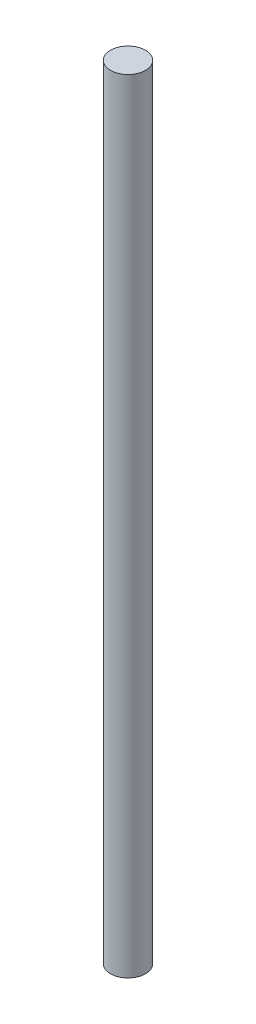
ISO-10303-21;
HEADER;
FILE_DESCRIPTION(('STEP AP214'),'2;1');
FILE_NAME('part.step','',(''),(''),'','','');
FILE_SCHEMA(('AUTOMOTIVE_DESIGN { 1 0 10303 214 1 1 1 1 }'));
ENDSEC;
DATA;
#1=APPLICATION_CONTEXT('core data for automotive mechanical design processes');
#2=APPLICATION_PROTOCOL_DEFINITION('international standard','automotive_design',2000,#1);
#3=PRODUCT_CONTEXT('',#1,'mechanical');
#4=PRODUCT('Part','Part','',(#3));
#5=PRODUCT_RELATED_PRODUCT_CATEGORY('part','',(#4));
#6=PRODUCT_DEFINITION_FORMATION('','',#4);
#7=PRODUCT_DEFINITION_CONTEXT('part definition',#1,'design');
#8=PRODUCT_DEFINITION('design','',#6,#7);
#9=PRODUCT_DEFINITION_SHAPE('','',#8);
#10=(LENGTH_UNIT() NAMED_UNIT(*) SI_UNIT(.MILLI.,.METRE.));
#11=(NAMED_UNIT(*) PLANE_ANGLE_UNIT() SI_UNIT($,.RADIAN.));
#12=(NAMED_UNIT(*) SI_UNIT($,.STERADIAN.) SOLID_ANGLE_UNIT());
#13=UNCERTAINTY_MEASURE_WITH_UNIT(LENGTH_MEASURE(1.E-05),#10,'distance_accuracy_value','');
#14=(GEOMETRIC_REPRESENTATION_CONTEXT(3) GLOBAL_UNCERTAINTY_ASSIGNED_CONTEXT((#13)) GLOBAL_UNIT_ASSIGNED_CONTEXT((#10,
#11,#12)) REPRESENTATION_CONTEXT('',''));
#15=CARTESIAN_POINT('',(0.,0.,0.));
#16=DIRECTION('',(0.,0.,1.));
#17=DIRECTION('',(1.,0.,0.));
#18=AXIS2_PLACEMENT_3D('',#15,#16,#17);
#19=CARTESIAN_POINT('',(0.,150.,0.));
#20=DIRECTION('',(0.,-1.,0.));
#21=DIRECTION('',(0.,0.,-1.));
#22=AXIS2_PLACEMENT_3D('',#19,#20,#21);
#23=CYLINDRICAL_SURFACE('',#22,3.35);
#24=CARTESIAN_POINT('',(0.,150.,0.));
#25=DIRECTION('',(0.,1.,0.));
#26=DIRECTION('',(0.,0.,1.));
#27=AXIS2_PLACEMENT_3D('',#24,#25,#26);
#28=CIRCLE('',#27,3.35);
#29=CARTESIAN_POINT('',(0.,150.,3.35));
#30=VERTEX_POINT('',#29);
#31=EDGE_CURVE('E10',#30,#30,#28,.T.);
#32=ORIENTED_EDGE('',*,*,#31,.F.);
#33=EDGE_LOOP('',(#32));
#34=FACE_BOUND('',#33,.T.);
#35=CARTESIAN_POINT('',(0.,0.,0.));
#36=DIRECTION('',(0.,1.,0.));
#37=DIRECTION('',(0.,0.,1.));
#38=AXIS2_PLACEMENT_3D('',#35,#36,#37);
#39=CIRCLE('',#38,3.35);
#40=CARTESIAN_POINT('',(0.,0.,3.35));
#41=VERTEX_POINT('',#40);
#42=EDGE_CURVE('E33',#41,#41,#39,.T.);
#43=ORIENTED_EDGE('',*,*,#42,.T.);
#44=EDGE_LOOP('',(#43));
#45=FACE_BOUND('',#44,.T.);
#46=ADVANCED_FACE('F30',(#34,#45),#23,.T.);
#47=CARTESIAN_POINT('',(0.,150.,0.));
#48=DIRECTION('',(0.,1.,0.));
#49=DIRECTION('',(0.,0.,1.));
#50=AXIS2_PLACEMENT_3D('',#47,#48,#49);
#51=PLANE('',#50);
#52=ORIENTED_EDGE('',*,*,#31,.T.);
#53=EDGE_LOOP('',(#52));
#54=FACE_BOUND('',#53,.T.);
#55=ADVANCED_FACE('F45',(#54),#51,.T.);
#56=CARTESIAN_POINT('',(0.,0.,0.));
#57=DIRECTION('',(0.,1.,0.));
#58=DIRECTION('',(0.,0.,1.));
#59=AXIS2_PLACEMENT_3D('',#56,#57,#58);
#60=PLANE('',#59);
#61=ORIENTED_EDGE('',*,*,#42,.F.);
#62=EDGE_LOOP('',(#61));
#63=FACE_BOUND('',#62,.T.);
#64=ADVANCED_FACE('F43',(#63),#60,.F.);
#65=CLOSED_SHELL('',(#46,#55,#64));
#66=MANIFOLD_SOLID_BREP('B2',#65);
#67=ADVANCED_BREP_SHAPE_REPRESENTATION('',(#18,#66),#14);
#68=SHAPE_DEFINITION_REPRESENTATION(#9,#67);
ENDSEC;
END-ISO-10303-21;
